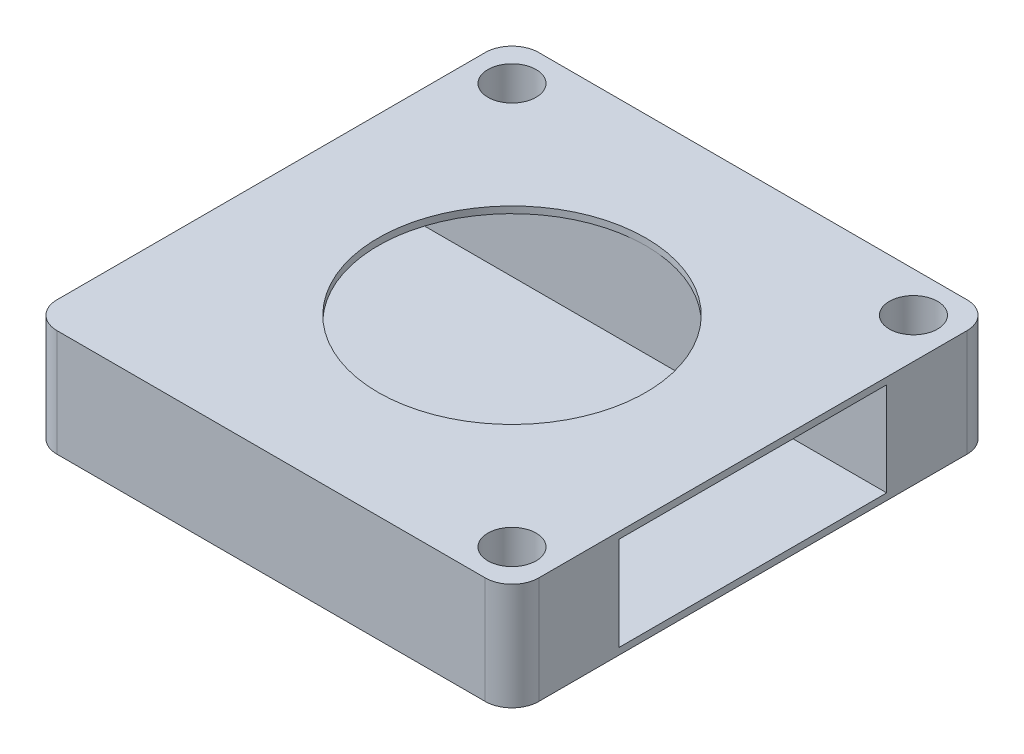
ISO-10303-21;
HEADER;
FILE_DESCRIPTION(('STEP AP214'),'2;1');
FILE_NAME('part.step','',(''),(''),'','','');
FILE_SCHEMA(('AUTOMOTIVE_DESIGN { 1 0 10303 214 1 1 1 1 }'));
ENDSEC;
DATA;
#1=APPLICATION_CONTEXT('core data for automotive mechanical design processes');
#2=APPLICATION_PROTOCOL_DEFINITION('international standard','automotive_design',2000,#1);
#3=PRODUCT_CONTEXT('',#1,'mechanical');
#4=PRODUCT('Part','Part','',(#3));
#5=PRODUCT_RELATED_PRODUCT_CATEGORY('part','',(#4));
#6=PRODUCT_DEFINITION_FORMATION('','',#4);
#7=PRODUCT_DEFINITION_CONTEXT('part definition',#1,'design');
#8=PRODUCT_DEFINITION('design','',#6,#7);
#9=PRODUCT_DEFINITION_SHAPE('','',#8);
#10=(LENGTH_UNIT() NAMED_UNIT(*) SI_UNIT(.MILLI.,.METRE.));
#11=(NAMED_UNIT(*) PLANE_ANGLE_UNIT() SI_UNIT($,.RADIAN.));
#12=(NAMED_UNIT(*) SI_UNIT($,.STERADIAN.) SOLID_ANGLE_UNIT());
#13=UNCERTAINTY_MEASURE_WITH_UNIT(LENGTH_MEASURE(1.E-05),#10,'distance_accuracy_value','');
#14=(GEOMETRIC_REPRESENTATION_CONTEXT(3) GLOBAL_UNCERTAINTY_ASSIGNED_CONTEXT((#13)) GLOBAL_UNIT_ASSIGNED_CONTEXT((#10,
#11,#12)) REPRESENTATION_CONTEXT('',''));
#15=CARTESIAN_POINT('',(0.,0.,0.));
#16=DIRECTION('',(0.,0.,1.));
#17=DIRECTION('',(1.,0.,0.));
#18=AXIS2_PLACEMENT_3D('',#15,#16,#17);
#19=CARTESIAN_POINT('',(8.,4.,-8.));
#20=DIRECTION('',(0.,-1.,0.));
#21=DIRECTION('',(0.,0.,-1.));
#22=AXIS2_PLACEMENT_3D('',#19,#20,#21);
#23=CYLINDRICAL_SURFACE('',#22,0.999999999999923);
#24=CARTESIAN_POINT('',(8.,0.,-8.));
#25=DIRECTION('',(0.,1.,0.));
#26=DIRECTION('',(0.,0.,1.));
#27=AXIS2_PLACEMENT_3D('',#24,#25,#26);
#28=CIRCLE('',#27,0.999999999999923);
#29=CARTESIAN_POINT('',(8.99999999999984,0.,-7.99999999999983));
#30=VERTEX_POINT('',#29);
#31=CARTESIAN_POINT('',(8.,0.,-9.));
#32=VERTEX_POINT('',#31);
#33=EDGE_CURVE('E188',#30,#32,#28,.T.);
#34=ORIENTED_EDGE('',*,*,#33,.T.);
#35=DIRECTION('',(0.,-1.,0.));
#36=VECTOR('',#35,1.);
#37=CARTESIAN_POINT('',(8.,4.,-9.));
#38=LINE('',#37,#36);
#39=CARTESIAN_POINT('',(8.,4.,-9.));
#40=VERTEX_POINT('',#39);
#41=EDGE_CURVE('E252',#40,#32,#38,.T.);
#42=ORIENTED_EDGE('',*,*,#41,.F.);
#43=CARTESIAN_POINT('',(8.,4.,-8.));
#44=DIRECTION('',(0.,1.,0.));
#45=DIRECTION('',(0.,0.,1.));
#46=AXIS2_PLACEMENT_3D('',#43,#44,#45);
#47=CIRCLE('',#46,0.999999999999923);
#48=CARTESIAN_POINT('',(8.99999999999984,4.,-7.99999999999983));
#49=VERTEX_POINT('',#48);
#50=EDGE_CURVE('E199',#49,#40,#47,.T.);
#51=ORIENTED_EDGE('',*,*,#50,.F.);
#52=DIRECTION('',(0.,-1.,0.));
#53=VECTOR('',#52,1.);
#54=CARTESIAN_POINT('',(8.99999999999984,4.,-7.99999999999983));
#55=LINE('',#54,#53);
#56=EDGE_CURVE('E217',#49,#30,#55,.T.);
#57=ORIENTED_EDGE('',*,*,#56,.T.);
#58=EDGE_LOOP('',(#34,#42,#51,#57));
#59=FACE_BOUND('',#58,.T.);
#60=ADVANCED_FACE('F43',(#59),#23,.T.);
#61=CARTESIAN_POINT('',(-8.00000000000108,4.,-8.99999999999991));
#62=DIRECTION('',(0.,0.,1.));
#63=DIRECTION('',(1.,0.,0.));
#64=AXIS2_PLACEMENT_3D('',#61,#62,#63);
#65=PLANE('',#64);
#66=DIRECTION('',(-1.,0.,0.));
#67=VECTOR('',#66,1.);
#68=CARTESIAN_POINT('',(-8.00000000000108,0.,-8.99999999999991));
#69=LINE('',#68,#67);
#70=CARTESIAN_POINT('',(-8.00000000000108,0.,-8.99999999999999));
#71=VERTEX_POINT('',#70);
#72=EDGE_CURVE('E220',#32,#71,#69,.T.);
#73=ORIENTED_EDGE('',*,*,#72,.T.);
#74=DIRECTION('',(0.,-1.,0.));
#75=VECTOR('',#74,1.);
#76=CARTESIAN_POINT('',(-8.00000000000108,4.,-8.99999999999999));
#77=LINE('',#76,#75);
#78=CARTESIAN_POINT('',(-8.00000000000108,4.,-8.99999999999999));
#79=VERTEX_POINT('',#78);
#80=EDGE_CURVE('E250',#79,#71,#77,.T.);
#81=ORIENTED_EDGE('',*,*,#80,.F.);
#82=DIRECTION('',(-1.,0.,0.));
#83=VECTOR('',#82,1.);
#84=CARTESIAN_POINT('',(-8.00000000000108,4.,-8.99999999999991));
#85=LINE('',#84,#83);
#86=EDGE_CURVE('E202',#40,#79,#85,.T.);
#87=ORIENTED_EDGE('',*,*,#86,.F.);
#88=ORIENTED_EDGE('',*,*,#41,.T.);
#89=EDGE_LOOP('',(#73,#81,#87,#88));
#90=FACE_BOUND('',#89,.T.);
#91=ADVANCED_FACE('F280',(#90),#65,.F.);
#92=CARTESIAN_POINT('',(-8.00000000000124,4.,-7.99999999999999));
#93=DIRECTION('',(0.,-1.,0.));
#94=DIRECTION('',(0.,0.,-1.));
#95=AXIS2_PLACEMENT_3D('',#92,#93,#94);
#96=CYLINDRICAL_SURFACE('',#95,0.999999999999999);
#97=CARTESIAN_POINT('',(-8.00000000000124,0.,-7.99999999999999));
#98=DIRECTION('',(0.,1.,0.));
#99=DIRECTION('',(0.,0.,1.));
#100=AXIS2_PLACEMENT_3D('',#97,#98,#99);
#101=CIRCLE('',#100,0.999999999999999);
#102=CARTESIAN_POINT('',(-9.00000000000132,0.,-7.99999999999999));
#103=VERTEX_POINT('',#102);
#104=EDGE_CURVE('E222',#71,#103,#101,.T.);
#105=ORIENTED_EDGE('',*,*,#104,.T.);
#106=DIRECTION('',(0.,-1.,0.));
#107=VECTOR('',#106,1.);
#108=CARTESIAN_POINT('',(-9.00000000000132,4.,-7.99999999999999));
#109=LINE('',#108,#107);
#110=CARTESIAN_POINT('',(-9.00000000000132,4.,-7.99999999999999));
#111=VERTEX_POINT('',#110);
#112=EDGE_CURVE('E247',#111,#103,#109,.T.);
#113=ORIENTED_EDGE('',*,*,#112,.F.);
#114=CARTESIAN_POINT('',(-8.00000000000124,4.,-7.99999999999999));
#115=DIRECTION('',(0.,1.,0.));
#116=DIRECTION('',(0.,0.,1.));
#117=AXIS2_PLACEMENT_3D('',#114,#115,#116);
#118=CIRCLE('',#117,0.999999999999999);
#119=EDGE_CURVE('E205',#79,#111,#118,.T.);
#120=ORIENTED_EDGE('',*,*,#119,.F.);
#121=ORIENTED_EDGE('',*,*,#80,.T.);
#122=EDGE_LOOP('',(#105,#113,#120,#121));
#123=FACE_BOUND('',#122,.T.);
#124=ADVANCED_FACE('F285',(#123),#96,.T.);
#125=CARTESIAN_POINT('',(-9.00000000000116,4.,8.00000000000108));
#126=DIRECTION('',(1.,0.,0.));
#127=DIRECTION('',(0.,0.,-1.));
#128=AXIS2_PLACEMENT_3D('',#125,#126,#127);
#129=PLANE('',#128);
#130=DIRECTION('',(0.,0.,1.));
#131=VECTOR('',#130,1.);
#132=CARTESIAN_POINT('',(-9.00000000000116,0.,8.00000000000108));
#133=LINE('',#132,#131);
#134=CARTESIAN_POINT('',(-9.00000000000116,0.,8.00000000000108));
#135=VERTEX_POINT('',#134);
#136=EDGE_CURVE('E224',#103,#135,#133,.T.);
#137=ORIENTED_EDGE('',*,*,#136,.T.);
#138=DIRECTION('',(0.,-1.,0.));
#139=VECTOR('',#138,1.);
#140=CARTESIAN_POINT('',(-9.00000000000116,4.,8.00000000000108));
#141=LINE('',#140,#139);
#142=CARTESIAN_POINT('',(-9.00000000000116,4.,8.00000000000108));
#143=VERTEX_POINT('',#142);
#144=EDGE_CURVE('E244',#143,#135,#141,.T.);
#145=ORIENTED_EDGE('',*,*,#144,.F.);
#146=DIRECTION('',(0.,0.,1.));
#147=VECTOR('',#146,1.);
#148=CARTESIAN_POINT('',(-9.00000000000116,4.,8.00000000000108));
#149=LINE('',#148,#147);
#150=EDGE_CURVE('E207',#111,#143,#149,.T.);
#151=ORIENTED_EDGE('',*,*,#150,.F.);
#152=ORIENTED_EDGE('',*,*,#112,.T.);
#153=EDGE_LOOP('',(#137,#145,#151,#152));
#154=FACE_BOUND('',#153,.T.);
#155=ADVANCED_FACE('F319',(#154),#129,.F.);
#156=CARTESIAN_POINT('',(-8.00000000000108,4.,8.00000000000108));
#157=DIRECTION('',(0.,-1.,0.));
#158=DIRECTION('',(0.,0.,-1.));
#159=AXIS2_PLACEMENT_3D('',#156,#157,#158);
#160=CYLINDRICAL_SURFACE('',#159,1.00000000000008);
#161=CARTESIAN_POINT('',(-8.00000000000108,0.,8.00000000000108));
#162=DIRECTION('',(0.,1.,0.));
#163=DIRECTION('',(0.,0.,1.));
#164=AXIS2_PLACEMENT_3D('',#161,#162,#163);
#165=CIRCLE('',#164,1.00000000000008);
#166=CARTESIAN_POINT('',(-8.00000000000108,0.,9.00000000000116));
#167=VERTEX_POINT('',#166);
#168=EDGE_CURVE('E226',#135,#167,#165,.T.);
#169=ORIENTED_EDGE('',*,*,#168,.T.);
#170=DIRECTION('',(0.,-1.,0.));
#171=VECTOR('',#170,1.);
#172=CARTESIAN_POINT('',(-8.00000000000108,4.,9.00000000000116));
#173=LINE('',#172,#171);
#174=CARTESIAN_POINT('',(-8.00000000000108,4.,9.00000000000116));
#175=VERTEX_POINT('',#174);
#176=EDGE_CURVE('E241',#175,#167,#173,.T.);
#177=ORIENTED_EDGE('',*,*,#176,.F.);
#178=CARTESIAN_POINT('',(-8.00000000000108,4.,8.00000000000108));
#179=DIRECTION('',(0.,1.,0.));
#180=DIRECTION('',(0.,0.,1.));
#181=AXIS2_PLACEMENT_3D('',#178,#179,#180);
#182=CIRCLE('',#181,1.00000000000008);
#183=EDGE_CURVE('E209',#143,#175,#182,.T.);
#184=ORIENTED_EDGE('',*,*,#183,.F.);
#185=ORIENTED_EDGE('',*,*,#144,.T.);
#186=EDGE_LOOP('',(#169,#177,#184,#185));
#187=FACE_BOUND('',#186,.T.);
#188=ADVANCED_FACE('F317',(#187),#160,.T.);
#189=CARTESIAN_POINT('',(-8.00000000000108,4.,9.00000000000116));
#190=DIRECTION('',(0.,0.,-1.));
#191=DIRECTION('',(-1.,0.,0.));
#192=AXIS2_PLACEMENT_3D('',#189,#190,#191);
#193=PLANE('',#192);
#194=DIRECTION('',(1.,0.,0.));
#195=VECTOR('',#194,1.);
#196=CARTESIAN_POINT('',(-8.00000000000108,0.,9.00000000000116));
#197=LINE('',#196,#195);
#198=CARTESIAN_POINT('',(7.99999999999983,0.,9.00000000000124));
#199=VERTEX_POINT('',#198);
#200=EDGE_CURVE('E228',#167,#199,#197,.T.);
#201=ORIENTED_EDGE('',*,*,#200,.T.);
#202=DIRECTION('',(0.,-1.,0.));
#203=VECTOR('',#202,1.);
#204=CARTESIAN_POINT('',(7.99999999999983,4.,9.00000000000124));
#205=LINE('',#204,#203);
#206=CARTESIAN_POINT('',(7.99999999999983,4.,9.00000000000124));
#207=VERTEX_POINT('',#206);
#208=EDGE_CURVE('E238',#207,#199,#205,.T.);
#209=ORIENTED_EDGE('',*,*,#208,.F.);
#210=DIRECTION('',(1.,0.,0.));
#211=VECTOR('',#210,1.);
#212=CARTESIAN_POINT('',(-8.00000000000108,4.,9.00000000000116));
#213=LINE('',#212,#211);
#214=EDGE_CURVE('E211',#175,#207,#213,.T.);
#215=ORIENTED_EDGE('',*,*,#214,.F.);
#216=ORIENTED_EDGE('',*,*,#176,.T.);
#217=EDGE_LOOP('',(#201,#209,#215,#216));
#218=FACE_BOUND('',#217,.T.);
#219=ADVANCED_FACE('F312',(#218),#193,.F.);
#220=CARTESIAN_POINT('',(8.,4.,8.00000000000124));
#221=DIRECTION('',(0.,-1.,0.));
#222=DIRECTION('',(0.,0.,-1.));
#223=AXIS2_PLACEMENT_3D('',#220,#221,#222);
#224=CYLINDRICAL_SURFACE('',#223,1.);
#225=CARTESIAN_POINT('',(8.,0.,8.00000000000124));
#226=DIRECTION('',(0.,1.,0.));
#227=DIRECTION('',(0.,0.,1.));
#228=AXIS2_PLACEMENT_3D('',#225,#226,#227);
#229=CIRCLE('',#228,1.);
#230=CARTESIAN_POINT('',(9.00000000000008,0.,8.00000000000124));
#231=VERTEX_POINT('',#230);
#232=EDGE_CURVE('E230',#199,#231,#229,.T.);
#233=ORIENTED_EDGE('',*,*,#232,.T.);
#234=DIRECTION('',(0.,-1.,0.));
#235=VECTOR('',#234,1.);
#236=CARTESIAN_POINT('',(9.00000000000008,4.,8.00000000000124));
#237=LINE('',#236,#235);
#238=CARTESIAN_POINT('',(9.00000000000008,4.,8.00000000000124));
#239=VERTEX_POINT('',#238);
#240=EDGE_CURVE('E235',#239,#231,#237,.T.);
#241=ORIENTED_EDGE('',*,*,#240,.F.);
#242=CARTESIAN_POINT('',(8.,4.,8.00000000000124));
#243=DIRECTION('',(0.,1.,0.));
#244=DIRECTION('',(0.,0.,1.));
#245=AXIS2_PLACEMENT_3D('',#242,#243,#244);
#246=CIRCLE('',#245,1.);
#247=EDGE_CURVE('E213',#207,#239,#246,.T.);
#248=ORIENTED_EDGE('',*,*,#247,.F.);
#249=ORIENTED_EDGE('',*,*,#208,.T.);
#250=EDGE_LOOP('',(#233,#241,#248,#249));
#251=FACE_BOUND('',#250,.T.);
#252=ADVANCED_FACE('F307',(#251),#224,.T.);
#253=CARTESIAN_POINT('',(9.00000000000008,4.,8.00000000000124));
#254=DIRECTION('',(-1.,0.,0.));
#255=DIRECTION('',(0.,0.,1.));
#256=AXIS2_PLACEMENT_3D('',#253,#254,#255);
#257=PLANE('',#256);
#258=DIRECTION('',(0.,0.,1.));
#259=VECTOR('',#258,1.);
#260=CARTESIAN_POINT('',(9.00000000000003,3.75,4.99999999999986));
#261=LINE('',#260,#259);
#262=CARTESIAN_POINT('',(8.99999999999988,3.75,-5.00000000000013));
#263=VERTEX_POINT('',#262);
#264=CARTESIAN_POINT('',(9.00000000000003,3.75,4.99999999999986));
#265=VERTEX_POINT('',#264);
#266=EDGE_CURVE('E167',#263,#265,#261,.T.);
#267=ORIENTED_EDGE('',*,*,#266,.F.);
#268=DIRECTION('',(0.,1.,0.));
#269=VECTOR('',#268,1.);
#270=CARTESIAN_POINT('',(8.99999999999988,0.25,-5.00000000000013));
#271=LINE('',#270,#269);
#272=CARTESIAN_POINT('',(8.99999999999988,0.25,-5.00000000000013));
#273=VERTEX_POINT('',#272);
#274=EDGE_CURVE('E57',#273,#263,#271,.T.);
#275=ORIENTED_EDGE('',*,*,#274,.F.);
#276=DIRECTION('',(0.,0.,-1.));
#277=VECTOR('',#276,1.);
#278=CARTESIAN_POINT('',(9.00000000000003,0.25,4.99999999999986));
#279=LINE('',#278,#277);
#280=CARTESIAN_POINT('',(9.00000000000003,0.25,4.99999999999986));
#281=VERTEX_POINT('',#280);
#282=EDGE_CURVE('E158',#281,#273,#279,.T.);
#283=ORIENTED_EDGE('',*,*,#282,.F.);
#284=DIRECTION('',(0.,-1.,0.));
#285=VECTOR('',#284,1.);
#286=CARTESIAN_POINT('',(9.00000000000003,0.25,4.99999999999986));
#287=LINE('',#286,#285);
#288=EDGE_CURVE('E161',#265,#281,#287,.T.);
#289=ORIENTED_EDGE('',*,*,#288,.F.);
#290=EDGE_LOOP('',(#267,#275,#283,#289));
#291=FACE_BOUND('',#290,.T.);
#292=DIRECTION('',(0.,0.,-1.));
#293=VECTOR('',#292,1.);
#294=CARTESIAN_POINT('',(9.00000000000008,0.,8.00000000000124));
#295=LINE('',#294,#293);
#296=EDGE_CURVE('E203',#231,#30,#295,.T.);
#297=ORIENTED_EDGE('',*,*,#296,.T.);
#298=ORIENTED_EDGE('',*,*,#56,.F.);
#299=DIRECTION('',(0.,0.,-1.));
#300=VECTOR('',#299,1.);
#301=CARTESIAN_POINT('',(9.00000000000008,4.,8.00000000000124));
#302=LINE('',#301,#300);
#303=EDGE_CURVE('E215',#239,#49,#302,.T.);
#304=ORIENTED_EDGE('',*,*,#303,.F.);
#305=ORIENTED_EDGE('',*,*,#240,.T.);
#306=EDGE_LOOP('',(#297,#298,#304,#305));
#307=FACE_BOUND('',#306,.T.);
#308=ADVANCED_FACE('F267',(#291,#307),#257,.F.);
#309=CARTESIAN_POINT('',(8.,4.,-8.));
#310=DIRECTION('',(0.,1.,0.));
#311=DIRECTION('',(0.,0.,1.));
#312=AXIS2_PLACEMENT_3D('',#309,#310,#311);
#313=PLANE('',#312);
#314=CARTESIAN_POINT('',(0.,4.,0.));
#315=DIRECTION('',(0.,1.,0.));
#316=DIRECTION('',(0.,0.,1.));
#317=AXIS2_PLACEMENT_3D('',#314,#315,#316);
#318=CIRCLE('',#317,5.);
#319=CARTESIAN_POINT('',(0.,4.,5.));
#320=VERTEX_POINT('',#319);
#321=EDGE_CURVE('E174',#320,#320,#318,.T.);
#322=ORIENTED_EDGE('',*,*,#321,.F.);
#323=EDGE_LOOP('',(#322));
#324=FACE_BOUND('',#323,.T.);
#325=CARTESIAN_POINT('',(-7.5,4.,-7.5));
#326=DIRECTION('',(0.,1.,0.));
#327=DIRECTION('',(0.,0.,-1.));
#328=AXIS2_PLACEMENT_3D('',#325,#326,#327);
#329=CIRCLE('',#328,0.9);
#330=CARTESIAN_POINT('',(-7.5,4.,-8.4));
#331=VERTEX_POINT('',#330);
#332=EDGE_CURVE('E181',#331,#331,#329,.T.);
#333=ORIENTED_EDGE('',*,*,#332,.F.);
#334=EDGE_LOOP('',(#333));
#335=FACE_BOUND('',#334,.T.);
#336=CARTESIAN_POINT('',(7.50000000000041,4.,7.5));
#337=DIRECTION('',(0.,1.,0.));
#338=DIRECTION('',(0.,0.,1.));
#339=AXIS2_PLACEMENT_3D('',#336,#337,#338);
#340=CIRCLE('',#339,0.899999999999897);
#341=CARTESIAN_POINT('',(7.50000000000041,4.,8.3999999999999));
#342=VERTEX_POINT('',#341);
#343=EDGE_CURVE('E185',#342,#342,#340,.T.);
#344=ORIENTED_EDGE('',*,*,#343,.F.);
#345=EDGE_LOOP('',(#344));
#346=FACE_BOUND('',#345,.T.);
#347=CARTESIAN_POINT('',(7.5,4.,-7.5));
#348=DIRECTION('',(0.,1.,0.));
#349=DIRECTION('',(0.,0.,-1.));
#350=AXIS2_PLACEMENT_3D('',#347,#348,#349);
#351=CIRCLE('',#350,0.900000000000033);
#352=CARTESIAN_POINT('',(7.5,4.,-8.40000000000003));
#353=VERTEX_POINT('',#352);
#354=EDGE_CURVE('E192',#353,#353,#351,.T.);
#355=ORIENTED_EDGE('',*,*,#354,.F.);
#356=EDGE_LOOP('',(#355));
#357=FACE_BOUND('',#356,.T.);
#358=ORIENTED_EDGE('',*,*,#50,.T.);
#359=ORIENTED_EDGE('',*,*,#86,.T.);
#360=ORIENTED_EDGE('',*,*,#119,.T.);
#361=ORIENTED_EDGE('',*,*,#150,.T.);
#362=ORIENTED_EDGE('',*,*,#183,.T.);
#363=ORIENTED_EDGE('',*,*,#214,.T.);
#364=ORIENTED_EDGE('',*,*,#247,.T.);
#365=ORIENTED_EDGE('',*,*,#303,.T.);
#366=EDGE_LOOP('',(#358,#359,#360,#361,#362,#363,#364,#365));
#367=FACE_BOUND('',#366,.T.);
#368=ADVANCED_FACE('F301',(#324,#335,#346,#357,#367),#313,.T.);
#369=CARTESIAN_POINT('',(8.,0.,-8.));
#370=DIRECTION('',(0.,1.,0.));
#371=DIRECTION('',(0.,0.,1.));
#372=AXIS2_PLACEMENT_3D('',#369,#370,#371);
#373=PLANE('',#372);
#374=CARTESIAN_POINT('',(-7.5,0.,-7.5));
#375=DIRECTION('',(0.,1.,0.));
#376=DIRECTION('',(0.,0.,1.));
#377=AXIS2_PLACEMENT_3D('',#374,#375,#376);
#378=CIRCLE('',#377,0.9);
#379=CARTESIAN_POINT('',(-7.5,0.,-6.6));
#380=VERTEX_POINT('',#379);
#381=EDGE_CURVE('E184',#380,#380,#378,.F.);
#382=ORIENTED_EDGE('',*,*,#381,.F.);
#383=EDGE_LOOP('',(#382));
#384=FACE_BOUND('',#383,.T.);
#385=CARTESIAN_POINT('',(7.50000000000041,0.,7.5));
#386=DIRECTION('',(0.,1.,0.));
#387=DIRECTION('',(0.,0.,1.));
#388=AXIS2_PLACEMENT_3D('',#385,#386,#387);
#389=CIRCLE('',#388,0.899999999999897);
#390=CARTESIAN_POINT('',(7.50000000000041,0.,8.3999999999999));
#391=VERTEX_POINT('',#390);
#392=EDGE_CURVE('E189',#391,#391,#389,.F.);
#393=ORIENTED_EDGE('',*,*,#392,.F.);
#394=EDGE_LOOP('',(#393));
#395=FACE_BOUND('',#394,.T.);
#396=CARTESIAN_POINT('',(7.5,0.,-7.5));
#397=DIRECTION('',(0.,1.,0.));
#398=DIRECTION('',(0.,0.,1.));
#399=AXIS2_PLACEMENT_3D('',#396,#397,#398);
#400=CIRCLE('',#399,0.900000000000033);
#401=CARTESIAN_POINT('',(7.5,0.,-6.59999999999997));
#402=VERTEX_POINT('',#401);
#403=EDGE_CURVE('E180',#402,#402,#400,.F.);
#404=ORIENTED_EDGE('',*,*,#403,.F.);
#405=EDGE_LOOP('',(#404));
#406=FACE_BOUND('',#405,.T.);
#407=ORIENTED_EDGE('',*,*,#33,.F.);
#408=ORIENTED_EDGE('',*,*,#296,.F.);
#409=ORIENTED_EDGE('',*,*,#232,.F.);
#410=ORIENTED_EDGE('',*,*,#200,.F.);
#411=ORIENTED_EDGE('',*,*,#168,.F.);
#412=ORIENTED_EDGE('',*,*,#136,.F.);
#413=ORIENTED_EDGE('',*,*,#104,.F.);
#414=ORIENTED_EDGE('',*,*,#72,.F.);
#415=EDGE_LOOP('',(#407,#408,#409,#410,#411,#412,#413,#414));
#416=FACE_BOUND('',#415,.T.);
#417=ADVANCED_FACE('F291',(#384,#395,#406,#416),#373,.F.);
#418=CARTESIAN_POINT('',(7.5,-0.00100000000000013,-7.5));
#419=DIRECTION('',(0.,1.,0.));
#420=DIRECTION('',(0.,0.,1.));
#421=AXIS2_PLACEMENT_3D('',#418,#419,#420);
#422=CYLINDRICAL_SURFACE('',#421,0.900000000000033);
#423=ORIENTED_EDGE('',*,*,#354,.T.);
#424=EDGE_LOOP('',(#423));
#425=FACE_BOUND('',#424,.T.);
#426=ORIENTED_EDGE('',*,*,#403,.T.);
#427=EDGE_LOOP('',(#426));
#428=FACE_BOUND('',#427,.T.);
#429=ADVANCED_FACE('F337',(#425,#428),#422,.F.);
#430=CARTESIAN_POINT('',(7.50000000000041,-0.00100000000000013,7.5));
#431=DIRECTION('',(0.,1.,0.));
#432=DIRECTION('',(0.,0.,1.));
#433=AXIS2_PLACEMENT_3D('',#430,#431,#432);
#434=CYLINDRICAL_SURFACE('',#433,0.899999999999897);
#435=ORIENTED_EDGE('',*,*,#343,.T.);
#436=EDGE_LOOP('',(#435));
#437=FACE_BOUND('',#436,.T.);
#438=ORIENTED_EDGE('',*,*,#392,.T.);
#439=EDGE_LOOP('',(#438));
#440=FACE_BOUND('',#439,.T.);
#441=ADVANCED_FACE('F344',(#437,#440),#434,.F.);
#442=CARTESIAN_POINT('',(-7.5,-0.00100000000000013,-7.5));
#443=DIRECTION('',(0.,1.,0.));
#444=DIRECTION('',(0.,0.,1.));
#445=AXIS2_PLACEMENT_3D('',#442,#443,#444);
#446=CYLINDRICAL_SURFACE('',#445,0.9);
#447=ORIENTED_EDGE('',*,*,#332,.T.);
#448=EDGE_LOOP('',(#447));
#449=FACE_BOUND('',#448,.T.);
#450=ORIENTED_EDGE('',*,*,#381,.T.);
#451=EDGE_LOOP('',(#450));
#452=FACE_BOUND('',#451,.T.);
#453=ADVANCED_FACE('F348',(#449,#452),#446,.F.);
#454=CARTESIAN_POINT('',(0.,-14.1421356237309,0.));
#455=DIRECTION('',(0.,1.,0.));
#456=DIRECTION('',(0.,0.,1.));
#457=AXIS2_PLACEMENT_3D('',#454,#455,#456);
#458=CYLINDRICAL_SURFACE('',#457,5.);
#459=CARTESIAN_POINT('',(0.,3.75,0.));
#460=DIRECTION('',(0.,1.,0.));
#461=DIRECTION('',(0.,0.,1.));
#462=AXIS2_PLACEMENT_3D('',#459,#460,#461);
#463=CIRCLE('',#462,5.);
#464=CARTESIAN_POINT('',(0.,3.75,-5.));
#465=VERTEX_POINT('',#464);
#466=CARTESIAN_POINT('',(0.,3.75,5.));
#467=VERTEX_POINT('',#466);
#468=EDGE_CURVE('E46',#465,#467,#463,.F.);
#469=ORIENTED_EDGE('',*,*,#468,.T.);
#470=EDGE_CURVE('E12',#467,#465,#463,.F.);
#471=ORIENTED_EDGE('',*,*,#470,.T.);
#472=EDGE_LOOP('',(#469,#471));
#473=FACE_BOUND('',#472,.T.);
#474=ORIENTED_EDGE('',*,*,#321,.T.);
#475=EDGE_LOOP('',(#474));
#476=FACE_BOUND('',#475,.T.);
#477=ADVANCED_FACE('F258',(#473,#476),#458,.F.);
#478=CARTESIAN_POINT('',(-8.49999999999998,3.75,5.00000000000013));
#479=DIRECTION('',(0.,1.,0.));
#480=DIRECTION('',(0.,0.,1.));
#481=AXIS2_PLACEMENT_3D('',#478,#479,#480);
#482=PLANE('',#481);
#483=DIRECTION('',(1.,0.,0.));
#484=VECTOR('',#483,1.);
#485=CARTESIAN_POINT('',(-8.49999999999998,3.75,5.00000000000013));
#486=LINE('',#485,#484);
#487=CARTESIAN_POINT('',(-8.49999999999998,3.75,5.00000000000013));
#488=VERTEX_POINT('',#487);
#489=EDGE_CURVE('E65',#488,#467,#486,.T.);
#490=ORIENTED_EDGE('',*,*,#489,.F.);
#491=DIRECTION('',(0.,0.,1.));
#492=VECTOR('',#491,1.);
#493=CARTESIAN_POINT('',(-8.49999999999998,3.75,5.00000000000013));
#494=LINE('',#493,#492);
#495=CARTESIAN_POINT('',(-8.50000000000013,3.75,-4.99999999999987));
#496=VERTEX_POINT('',#495);
#497=EDGE_CURVE('E149',#496,#488,#494,.T.);
#498=ORIENTED_EDGE('',*,*,#497,.F.);
#499=DIRECTION('',(1.,0.,0.));
#500=VECTOR('',#499,1.);
#501=CARTESIAN_POINT('',(-8.50000000000013,3.75,-4.99999999999987));
#502=LINE('',#501,#500);
#503=EDGE_CURVE('E137',#496,#465,#502,.T.);
#504=ORIENTED_EDGE('',*,*,#503,.T.);
#505=ORIENTED_EDGE('',*,*,#470,.F.);
#506=EDGE_LOOP('',(#490,#498,#504,#505));
#507=FACE_BOUND('',#506,.T.);
#508=ADVANCED_FACE('F150',(#507),#482,.F.);
#509=EDGE_CURVE('E143',#465,#263,#502,.T.);
#510=ORIENTED_EDGE('',*,*,#509,.T.);
#511=ORIENTED_EDGE('',*,*,#266,.T.);
#512=EDGE_CURVE('E146',#467,#265,#486,.T.);
#513=ORIENTED_EDGE('',*,*,#512,.F.);
#514=ORIENTED_EDGE('',*,*,#468,.F.);
#515=EDGE_LOOP('',(#510,#511,#513,#514));
#516=FACE_BOUND('',#515,.T.);
#517=ADVANCED_FACE('F261',(#516),#482,.F.);
#518=CARTESIAN_POINT('',(-8.50000000000013,0.25,-4.99999999999987));
#519=DIRECTION('',(0.,0.,-1.));
#520=DIRECTION('',(-1.,0.,0.));
#521=AXIS2_PLACEMENT_3D('',#518,#519,#520);
#522=PLANE('',#521);
#523=ORIENTED_EDGE('',*,*,#503,.F.);
#524=DIRECTION('',(0.,1.,0.));
#525=VECTOR('',#524,1.);
#526=CARTESIAN_POINT('',(-8.50000000000013,0.25,-4.99999999999987));
#527=LINE('',#526,#525);
#528=CARTESIAN_POINT('',(-8.50000000000013,0.25,-4.99999999999987));
#529=VERTEX_POINT('',#528);
#530=EDGE_CURVE('E141',#529,#496,#527,.T.);
#531=ORIENTED_EDGE('',*,*,#530,.F.);
#532=DIRECTION('',(1.,0.,0.));
#533=VECTOR('',#532,1.);
#534=CARTESIAN_POINT('',(-8.50000000000013,0.25,-4.99999999999987));
#535=LINE('',#534,#533);
#536=EDGE_CURVE('E172',#529,#273,#535,.T.);
#537=ORIENTED_EDGE('',*,*,#536,.T.);
#538=ORIENTED_EDGE('',*,*,#274,.T.);
#539=ORIENTED_EDGE('',*,*,#509,.F.);
#540=EDGE_LOOP('',(#523,#531,#537,#538,#539));
#541=FACE_BOUND('',#540,.T.);
#542=ADVANCED_FACE('F139',(#541),#522,.F.);
#543=CARTESIAN_POINT('',(-8.49999999999998,0.25,5.00000000000013));
#544=DIRECTION('',(0.,0.,1.));
#545=DIRECTION('',(1.,0.,0.));
#546=AXIS2_PLACEMENT_3D('',#543,#544,#545);
#547=PLANE('',#546);
#548=ORIENTED_EDGE('',*,*,#512,.T.);
#549=ORIENTED_EDGE('',*,*,#288,.T.);
#550=DIRECTION('',(1.,0.,0.));
#551=VECTOR('',#550,1.);
#552=CARTESIAN_POINT('',(-8.49999999999998,0.25,5.00000000000013));
#553=LINE('',#552,#551);
#554=CARTESIAN_POINT('',(-8.49999999999998,0.25,5.00000000000013));
#555=VERTEX_POINT('',#554);
#556=EDGE_CURVE('E175',#555,#281,#553,.T.);
#557=ORIENTED_EDGE('',*,*,#556,.F.);
#558=DIRECTION('',(0.,-1.,0.));
#559=VECTOR('',#558,1.);
#560=CARTESIAN_POINT('',(-8.49999999999998,0.25,5.00000000000013));
#561=LINE('',#560,#559);
#562=EDGE_CURVE('E153',#488,#555,#561,.T.);
#563=ORIENTED_EDGE('',*,*,#562,.F.);
#564=ORIENTED_EDGE('',*,*,#489,.T.);
#565=EDGE_LOOP('',(#548,#549,#557,#563,#564));
#566=FACE_BOUND('',#565,.T.);
#567=ADVANCED_FACE('F264',(#566),#547,.F.);
#568=CARTESIAN_POINT('',(-8.50000000000005,0.,1.29464581416477E-13));
#569=DIRECTION('',(-1.,0.,0.));
#570=DIRECTION('',(0.,0.,1.));
#571=AXIS2_PLACEMENT_3D('',#568,#569,#570);
#572=PLANE('',#571);
#573=ORIENTED_EDGE('',*,*,#530,.T.);
#574=ORIENTED_EDGE('',*,*,#497,.T.);
#575=ORIENTED_EDGE('',*,*,#562,.T.);
#576=DIRECTION('',(0.,0.,-1.));
#577=VECTOR('',#576,1.);
#578=CARTESIAN_POINT('',(-8.49999999999998,0.25,5.00000000000013));
#579=LINE('',#578,#577);
#580=EDGE_CURVE('E157',#555,#529,#579,.T.);
#581=ORIENTED_EDGE('',*,*,#580,.T.);
#582=EDGE_LOOP('',(#573,#574,#575,#581));
#583=FACE_BOUND('',#582,.T.);
#584=ADVANCED_FACE('F155',(#583),#572,.F.);
#585=CARTESIAN_POINT('',(8.,0.25,-8.));
#586=DIRECTION('',(0.,1.,0.));
#587=DIRECTION('',(0.,0.,1.));
#588=AXIS2_PLACEMENT_3D('',#585,#586,#587);
#589=PLANE('',#588);
#590=ORIENTED_EDGE('',*,*,#282,.T.);
#591=ORIENTED_EDGE('',*,*,#536,.F.);
#592=ORIENTED_EDGE('',*,*,#580,.F.);
#593=ORIENTED_EDGE('',*,*,#556,.T.);
#594=EDGE_LOOP('',(#590,#591,#592,#593));
#595=FACE_BOUND('',#594,.T.);
#596=ADVANCED_FACE('F270',(#595),#589,.T.);
#597=CLOSED_SHELL('',(#60,#91,#124,#155,#188,#219,#252,#308,#368,#417,#429,#441,#453,#477,#508,
#517,#542,#567,#584,#596));
#598=MANIFOLD_SOLID_BREP('B2',#597);
#599=ADVANCED_BREP_SHAPE_REPRESENTATION('',(#18,#598),#14);
#600=SHAPE_DEFINITION_REPRESENTATION(#9,#599);
ENDSEC;
END-ISO-10303-21;
